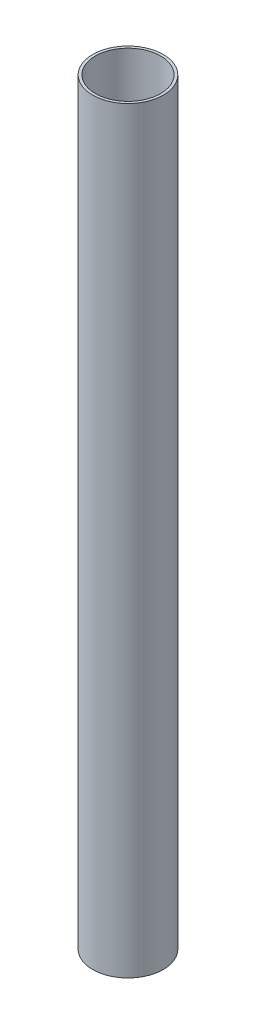
ISO-10303-21;
HEADER;
FILE_DESCRIPTION(('STEP AP214'),'2;1');
FILE_NAME('part.step','',(''),(''),'','','');
FILE_SCHEMA(('AUTOMOTIVE_DESIGN { 1 0 10303 214 1 1 1 1 }'));
ENDSEC;
DATA;
#1=APPLICATION_CONTEXT('core data for automotive mechanical design processes');
#2=APPLICATION_PROTOCOL_DEFINITION('international standard','automotive_design',2000,#1);
#3=PRODUCT_CONTEXT('',#1,'mechanical');
#4=PRODUCT('Part','Part','',(#3));
#5=PRODUCT_RELATED_PRODUCT_CATEGORY('part','',(#4));
#6=PRODUCT_DEFINITION_FORMATION('','',#4);
#7=PRODUCT_DEFINITION_CONTEXT('part definition',#1,'design');
#8=PRODUCT_DEFINITION('design','',#6,#7);
#9=PRODUCT_DEFINITION_SHAPE('','',#8);
#10=(LENGTH_UNIT() NAMED_UNIT(*) SI_UNIT(.MILLI.,.METRE.));
#11=(NAMED_UNIT(*) PLANE_ANGLE_UNIT() SI_UNIT($,.RADIAN.));
#12=(NAMED_UNIT(*) SI_UNIT($,.STERADIAN.) SOLID_ANGLE_UNIT());
#13=UNCERTAINTY_MEASURE_WITH_UNIT(LENGTH_MEASURE(1.E-05),#10,'distance_accuracy_value','');
#14=(GEOMETRIC_REPRESENTATION_CONTEXT(3) GLOBAL_UNCERTAINTY_ASSIGNED_CONTEXT((#13)) GLOBAL_UNIT_ASSIGNED_CONTEXT((#10,
#11,#12)) REPRESENTATION_CONTEXT('',''));
#15=CARTESIAN_POINT('',(0.,0.,0.));
#16=DIRECTION('',(0.,0.,1.));
#17=DIRECTION('',(1.,0.,0.));
#18=AXIS2_PLACEMENT_3D('',#15,#16,#17);
#19=CARTESIAN_POINT('',(0.,0.,0.));
#20=DIRECTION('',(0.,1.,0.));
#21=DIRECTION('',(0.,0.,1.));
#22=AXIS2_PLACEMENT_3D('',#19,#20,#21);
#23=CYLINDRICAL_SURFACE('',#22,34.29);
#24=CARTESIAN_POINT('',(0.,736.6,0.));
#25=DIRECTION('',(0.,1.,0.));
#26=DIRECTION('',(0.,0.,1.));
#27=AXIS2_PLACEMENT_3D('',#24,#25,#26);
#28=CIRCLE('',#27,34.29);
#29=CARTESIAN_POINT('',(0.,736.6,34.29));
#30=VERTEX_POINT('',#29);
#31=EDGE_CURVE('E51',#30,#30,#28,.T.);
#32=ORIENTED_EDGE('',*,*,#31,.F.);
#33=EDGE_LOOP('',(#32));
#34=FACE_BOUND('',#33,.T.);
#35=CARTESIAN_POINT('',(0.,0.,0.));
#36=DIRECTION('',(0.,1.,0.));
#37=DIRECTION('',(0.,0.,1.));
#38=AXIS2_PLACEMENT_3D('',#35,#36,#37);
#39=CIRCLE('',#38,34.29);
#40=CARTESIAN_POINT('',(0.,0.,34.29));
#41=VERTEX_POINT('',#40);
#42=EDGE_CURVE('E40',#41,#41,#39,.T.);
#43=ORIENTED_EDGE('',*,*,#42,.T.);
#44=EDGE_LOOP('',(#43));
#45=FACE_BOUND('',#44,.T.);
#46=ADVANCED_FACE('F37',(#34,#45),#23,.T.);
#47=CARTESIAN_POINT('',(0.,0.,0.));
#48=DIRECTION('',(0.,1.,0.));
#49=DIRECTION('',(0.,0.,1.));
#50=AXIS2_PLACEMENT_3D('',#47,#48,#49);
#51=PLANE('',#50);
#52=CARTESIAN_POINT('',(0.,0.,0.));
#53=DIRECTION('',(0.,1.,0.));
#54=DIRECTION('',(0.,0.,1.));
#55=AXIS2_PLACEMENT_3D('',#52,#53,#54);
#56=CIRCLE('',#55,31.75);
#57=CARTESIAN_POINT('',(0.,0.,31.75));
#58=VERTEX_POINT('',#57);
#59=EDGE_CURVE('E45',#58,#58,#56,.F.);
#60=ORIENTED_EDGE('',*,*,#59,.F.);
#61=EDGE_LOOP('',(#60));
#62=FACE_BOUND('',#61,.T.);
#63=ORIENTED_EDGE('',*,*,#42,.F.);
#64=EDGE_LOOP('',(#63));
#65=FACE_BOUND('',#64,.T.);
#66=ADVANCED_FACE('F62',(#62,#65),#51,.F.);
#67=CARTESIAN_POINT('',(0.,736.6,0.));
#68=DIRECTION('',(0.,1.,0.));
#69=DIRECTION('',(0.,0.,1.));
#70=AXIS2_PLACEMENT_3D('',#67,#68,#69);
#71=PLANE('',#70);
#72=CARTESIAN_POINT('',(0.,736.6,0.));
#73=DIRECTION('',(0.,1.,0.));
#74=DIRECTION('',(0.,0.,1.));
#75=AXIS2_PLACEMENT_3D('',#72,#73,#74);
#76=CIRCLE('',#75,31.75);
#77=CARTESIAN_POINT('',(0.,736.6,31.75));
#78=VERTEX_POINT('',#77);
#79=EDGE_CURVE('E10',#78,#78,#76,.F.);
#80=ORIENTED_EDGE('',*,*,#79,.T.);
#81=EDGE_LOOP('',(#80));
#82=FACE_BOUND('',#81,.T.);
#83=ORIENTED_EDGE('',*,*,#31,.T.);
#84=EDGE_LOOP('',(#83));
#85=FACE_BOUND('',#84,.T.);
#86=ADVANCED_FACE('F64',(#82,#85),#71,.T.);
#87=CARTESIAN_POINT('',(0.,0.,0.));
#88=DIRECTION('',(0.,1.,0.));
#89=DIRECTION('',(0.,0.,1.));
#90=AXIS2_PLACEMENT_3D('',#87,#88,#89);
#91=CYLINDRICAL_SURFACE('',#90,31.75);
#92=ORIENTED_EDGE('',*,*,#79,.F.);
#93=EDGE_LOOP('',(#92));
#94=FACE_BOUND('',#93,.T.);
#95=ORIENTED_EDGE('',*,*,#59,.T.);
#96=EDGE_LOOP('',(#95));
#97=FACE_BOUND('',#96,.T.);
#98=ADVANCED_FACE('F70',(#94,#97),#91,.F.);
#99=CLOSED_SHELL('',(#46,#66,#86,#98));
#100=MANIFOLD_SOLID_BREP('B2',#99);
#101=ADVANCED_BREP_SHAPE_REPRESENTATION('',(#18,#100),#14);
#102=SHAPE_DEFINITION_REPRESENTATION(#9,#101);
ENDSEC;
END-ISO-10303-21;
